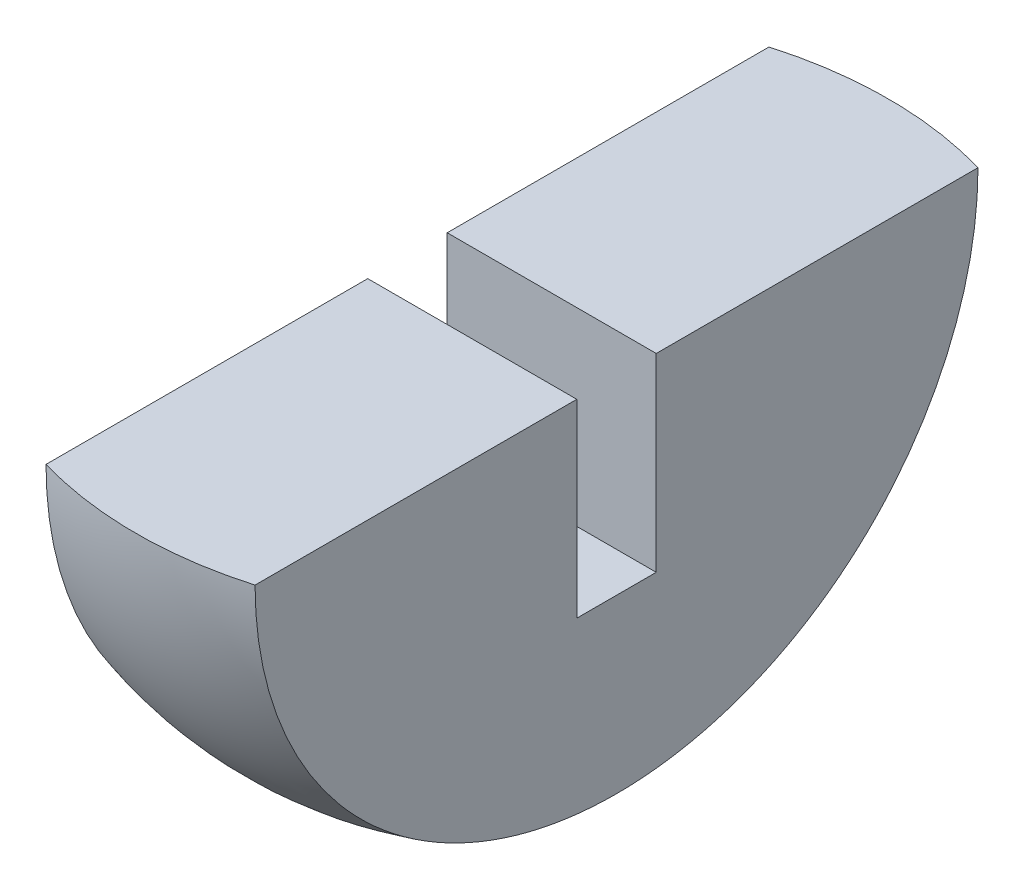
ISO-10303-21;
HEADER;
FILE_DESCRIPTION(('STEP AP214'),'2;1');
FILE_NAME('part.step','',(''),(''),'','','');
FILE_SCHEMA(('AUTOMOTIVE_DESIGN { 1 0 10303 214 1 1 1 1 }'));
ENDSEC;
DATA;
#1=APPLICATION_CONTEXT('core data for automotive mechanical design processes');
#2=APPLICATION_PROTOCOL_DEFINITION('international standard','automotive_design',2000,#1);
#3=PRODUCT_CONTEXT('',#1,'mechanical');
#4=PRODUCT('Part','Part','',(#3));
#5=PRODUCT_RELATED_PRODUCT_CATEGORY('part','',(#4));
#6=PRODUCT_DEFINITION_FORMATION('','',#4);
#7=PRODUCT_DEFINITION_CONTEXT('part definition',#1,'design');
#8=PRODUCT_DEFINITION('design','',#6,#7);
#9=PRODUCT_DEFINITION_SHAPE('','',#8);
#10=(LENGTH_UNIT() NAMED_UNIT(*) SI_UNIT(.MILLI.,.METRE.));
#11=(NAMED_UNIT(*) PLANE_ANGLE_UNIT() SI_UNIT($,.RADIAN.));
#12=(NAMED_UNIT(*) SI_UNIT($,.STERADIAN.) SOLID_ANGLE_UNIT());
#13=UNCERTAINTY_MEASURE_WITH_UNIT(LENGTH_MEASURE(1.E-05),#10,'distance_accuracy_value','');
#14=(GEOMETRIC_REPRESENTATION_CONTEXT(3) GLOBAL_UNCERTAINTY_ASSIGNED_CONTEXT((#13)) GLOBAL_UNIT_ASSIGNED_CONTEXT((#10,
#11,#12)) REPRESENTATION_CONTEXT('',''));
#15=CARTESIAN_POINT('',(0.,0.,0.));
#16=DIRECTION('',(0.,0.,1.));
#17=DIRECTION('',(1.,0.,0.));
#18=AXIS2_PLACEMENT_3D('',#15,#16,#17);
#19=CARTESIAN_POINT('',(0.,0.,0.));
#20=DIRECTION('',(0.,-1.,0.));
#21=DIRECTION('',(0.,0.,-1.));
#22=AXIS2_PLACEMENT_3D('',#19,#20,#21);
#23=PLANE('',#22);
#24=DIRECTION('',(1.,0.,0.));
#25=VECTOR('',#24,1.);
#26=CARTESIAN_POINT('',(0.,0.,-14.25));
#27=LINE('',#26,#25);
#28=CARTESIAN_POINT('',(-37.5,0.,-14.25));
#29=VERTEX_POINT('',#28);
#30=CARTESIAN_POINT('',(37.5,0.,-14.25));
#31=VERTEX_POINT('',#30);
#32=EDGE_CURVE('E107',#29,#31,#27,.T.);
#33=ORIENTED_EDGE('',*,*,#32,.T.);
#34=DIRECTION('',(0.,0.,-1.));
#35=VECTOR('',#34,1.);
#36=CARTESIAN_POINT('',(37.5,0.,0.));
#37=LINE('',#36,#35);
#38=CARTESIAN_POINT('',(37.5,0.,-129.687123493429));
#39=VERTEX_POINT('',#38);
#40=EDGE_CURVE('E56',#31,#39,#37,.T.);
#41=ORIENTED_EDGE('',*,*,#40,.T.);
#42=CARTESIAN_POINT('',(0.,0.,0.));
#43=DIRECTION('',(0.,-1.,0.));
#44=DIRECTION('',(0.,0.,-1.));
#45=AXIS2_PLACEMENT_3D('',#42,#43,#44);
#46=CIRCLE('',#45,135.);
#47=CARTESIAN_POINT('',(-37.5,0.,-129.687123493429));
#48=VERTEX_POINT('',#47);
#49=EDGE_CURVE('E152',#48,#39,#46,.T.);
#50=ORIENTED_EDGE('',*,*,#49,.F.);
#51=DIRECTION('',(0.,0.,-1.));
#52=VECTOR('',#51,1.);
#53=CARTESIAN_POINT('',(-37.5,0.,0.));
#54=LINE('',#53,#52);
#55=EDGE_CURVE('E155',#29,#48,#54,.T.);
#56=ORIENTED_EDGE('',*,*,#55,.F.);
#57=EDGE_LOOP('',(#33,#41,#50,#56));
#58=FACE_BOUND('',#57,.T.);
#59=ADVANCED_FACE('F47',(#58),#23,.F.);
#60=CARTESIAN_POINT('',(-37.5,1.26405277612711E-13,-135.));
#61=DIRECTION('',(-1.,0.,0.));
#62=DIRECTION('',(0.,-1.,0.));
#63=AXIS2_PLACEMENT_3D('',#60,#61,#62);
#64=PLANE('',#63);
#65=DIRECTION('',(0.,0.,1.));
#66=VECTOR('',#65,1.);
#67=CARTESIAN_POINT('',(-37.5,-68.,0.));
#68=LINE('',#67,#66);
#69=CARTESIAN_POINT('',(-37.5,-68.,-14.25));
#70=VERTEX_POINT('',#69);
#71=CARTESIAN_POINT('',(-37.5,-68.,14.25));
#72=VERTEX_POINT('',#71);
#73=EDGE_CURVE('E116',#70,#72,#68,.T.);
#74=ORIENTED_EDGE('',*,*,#73,.F.);
#75=DIRECTION('',(0.,1.,0.));
#76=VECTOR('',#75,1.);
#77=CARTESIAN_POINT('',(-37.5,-68.,-14.25));
#78=LINE('',#77,#76);
#79=EDGE_CURVE('E102',#70,#29,#78,.T.);
#80=ORIENTED_EDGE('',*,*,#79,.T.);
#81=ORIENTED_EDGE('',*,*,#55,.T.);
#82=CARTESIAN_POINT('',(-37.5,1.26405277612711E-13,0.));
#83=DIRECTION('',(-1.,0.,0.));
#84=DIRECTION('',(0.,-1.,0.));
#85=AXIS2_PLACEMENT_3D('',#82,#83,#84);
#86=CIRCLE('',#85,129.687123493429);
#87=CARTESIAN_POINT('',(-37.5,0.,129.687123493429));
#88=VERTEX_POINT('',#87);
#89=EDGE_CURVE('E139',#88,#48,#86,.F.);
#90=ORIENTED_EDGE('',*,*,#89,.F.);
#91=CARTESIAN_POINT('',(-37.5,0.,14.25));
#92=VERTEX_POINT('',#91);
#93=EDGE_CURVE('E156',#88,#92,#54,.T.);
#94=ORIENTED_EDGE('',*,*,#93,.T.);
#95=DIRECTION('',(0.,1.,0.));
#96=VECTOR('',#95,1.);
#97=CARTESIAN_POINT('',(-37.5,-68.,14.25));
#98=LINE('',#97,#96);
#99=EDGE_CURVE('E112',#72,#92,#98,.T.);
#100=ORIENTED_EDGE('',*,*,#99,.F.);
#101=EDGE_LOOP('',(#74,#80,#81,#90,#94,#100));
#102=FACE_BOUND('',#101,.T.);
#103=ADVANCED_FACE('F123',(#102),#64,.T.);
#104=CARTESIAN_POINT('',(37.5,1.3041814356867E-13,-135.));
#105=DIRECTION('',(-1.,0.,0.));
#106=DIRECTION('',(0.,-1.,0.));
#107=AXIS2_PLACEMENT_3D('',#104,#105,#106);
#108=PLANE('',#107);
#109=DIRECTION('',(0.,1.,0.));
#110=VECTOR('',#109,1.);
#111=CARTESIAN_POINT('',(37.5,-68.,-14.25));
#112=LINE('',#111,#110);
#113=CARTESIAN_POINT('',(37.5,-68.,-14.25));
#114=VERTEX_POINT('',#113);
#115=EDGE_CURVE('E136',#114,#31,#112,.T.);
#116=ORIENTED_EDGE('',*,*,#115,.F.);
#117=DIRECTION('',(0.,0.,-1.));
#118=VECTOR('',#117,1.);
#119=CARTESIAN_POINT('',(37.5,-68.,0.));
#120=LINE('',#119,#118);
#121=CARTESIAN_POINT('',(37.5000000000002,-68.,14.25));
#122=VERTEX_POINT('',#121);
#123=EDGE_CURVE('E113',#122,#114,#120,.T.);
#124=ORIENTED_EDGE('',*,*,#123,.F.);
#125=DIRECTION('',(0.,1.,0.));
#126=VECTOR('',#125,1.);
#127=CARTESIAN_POINT('',(37.5,-68.,14.25));
#128=LINE('',#127,#126);
#129=CARTESIAN_POINT('',(37.5,0.,14.25));
#130=VERTEX_POINT('',#129);
#131=EDGE_CURVE('E140',#122,#130,#128,.T.);
#132=ORIENTED_EDGE('',*,*,#131,.T.);
#133=CARTESIAN_POINT('',(37.5,0.,129.687123493429));
#134=VERTEX_POINT('',#133);
#135=EDGE_CURVE('E11',#134,#130,#37,.T.);
#136=ORIENTED_EDGE('',*,*,#135,.F.);
#137=CARTESIAN_POINT('',(37.5,1.3041814356867E-13,0.));
#138=DIRECTION('',(-1.,0.,0.));
#139=DIRECTION('',(0.,-1.,0.));
#140=AXIS2_PLACEMENT_3D('',#137,#138,#139);
#141=CIRCLE('',#140,129.687123493429);
#142=EDGE_CURVE('E148',#134,#39,#141,.F.);
#143=ORIENTED_EDGE('',*,*,#142,.T.);
#144=ORIENTED_EDGE('',*,*,#40,.F.);
#145=EDGE_LOOP('',(#116,#124,#132,#136,#143,#144));
#146=FACE_BOUND('',#145,.T.);
#147=ADVANCED_FACE('F167',(#146),#108,.F.);
#148=CARTESIAN_POINT('',(0.,0.,0.));
#149=DIRECTION('',(0.,-1.,0.));
#150=DIRECTION('',(-1.,0.,0.));
#151=AXIS2_PLACEMENT_3D('',#148,#149,#150);
#152=SPHERICAL_SURFACE('',#151,135.);
#153=ORIENTED_EDGE('',*,*,#142,.F.);
#154=EDGE_CURVE('E71',#134,#88,#46,.T.);
#155=ORIENTED_EDGE('',*,*,#154,.T.);
#156=ORIENTED_EDGE('',*,*,#89,.T.);
#157=ORIENTED_EDGE('',*,*,#49,.T.);
#158=EDGE_LOOP('',(#153,#155,#156,#157));
#159=FACE_BOUND('',#158,.T.);
#160=ADVANCED_FACE('F49',(#159),#152,.T.);
#161=ORIENTED_EDGE('',*,*,#135,.T.);
#162=DIRECTION('',(1.,0.,0.));
#163=VECTOR('',#162,1.);
#164=CARTESIAN_POINT('',(0.,0.,14.25));
#165=LINE('',#164,#163);
#166=EDGE_CURVE('E121',#92,#130,#165,.T.);
#167=ORIENTED_EDGE('',*,*,#166,.F.);
#168=ORIENTED_EDGE('',*,*,#93,.F.);
#169=ORIENTED_EDGE('',*,*,#154,.F.);
#170=EDGE_LOOP('',(#161,#167,#168,#169));
#171=FACE_BOUND('',#170,.T.);
#172=ADVANCED_FACE('F166',(#171),#23,.F.);
#173=CARTESIAN_POINT('',(0.,-68.,-14.25));
#174=DIRECTION('',(0.,0.,1.));
#175=DIRECTION('',(1.,0.,0.));
#176=AXIS2_PLACEMENT_3D('',#173,#174,#175);
#177=PLANE('',#176);
#178=ORIENTED_EDGE('',*,*,#32,.F.);
#179=ORIENTED_EDGE('',*,*,#79,.F.);
#180=DIRECTION('',(1.,0.,0.));
#181=VECTOR('',#180,1.);
#182=CARTESIAN_POINT('',(0.,-68.,-14.25));
#183=LINE('',#182,#181);
#184=EDGE_CURVE('E105',#70,#114,#183,.T.);
#185=ORIENTED_EDGE('',*,*,#184,.T.);
#186=ORIENTED_EDGE('',*,*,#115,.T.);
#187=EDGE_LOOP('',(#178,#179,#185,#186));
#188=FACE_BOUND('',#187,.T.);
#189=ADVANCED_FACE('F104',(#188),#177,.T.);
#190=CARTESIAN_POINT('',(0.,-68.,14.25));
#191=DIRECTION('',(0.,0.,1.));
#192=DIRECTION('',(1.,0.,0.));
#193=AXIS2_PLACEMENT_3D('',#190,#191,#192);
#194=PLANE('',#193);
#195=ORIENTED_EDGE('',*,*,#166,.T.);
#196=ORIENTED_EDGE('',*,*,#131,.F.);
#197=DIRECTION('',(1.,0.,0.));
#198=VECTOR('',#197,1.);
#199=CARTESIAN_POINT('',(0.,-68.,14.25));
#200=LINE('',#199,#198);
#201=EDGE_CURVE('E63',#72,#122,#200,.T.);
#202=ORIENTED_EDGE('',*,*,#201,.F.);
#203=ORIENTED_EDGE('',*,*,#99,.T.);
#204=EDGE_LOOP('',(#195,#196,#202,#203));
#205=FACE_BOUND('',#204,.T.);
#206=ADVANCED_FACE('F183',(#205),#194,.F.);
#207=CARTESIAN_POINT('',(0.,-68.,0.));
#208=DIRECTION('',(0.,1.,0.));
#209=DIRECTION('',(0.,0.,1.));
#210=AXIS2_PLACEMENT_3D('',#207,#208,#209);
#211=PLANE('',#210);
#212=ORIENTED_EDGE('',*,*,#184,.F.);
#213=ORIENTED_EDGE('',*,*,#73,.T.);
#214=ORIENTED_EDGE('',*,*,#201,.T.);
#215=ORIENTED_EDGE('',*,*,#123,.T.);
#216=EDGE_LOOP('',(#212,#213,#214,#215));
#217=FACE_BOUND('',#216,.T.);
#218=ADVANCED_FACE('F115',(#217),#211,.T.);
#219=CLOSED_SHELL('',(#59,#103,#147,#160,#172,#189,#206,#218));
#220=MANIFOLD_SOLID_BREP('B2',#219);
#221=ADVANCED_BREP_SHAPE_REPRESENTATION('',(#18,#220),#14);
#222=SHAPE_DEFINITION_REPRESENTATION(#9,#221);
ENDSEC;
END-ISO-10303-21;
